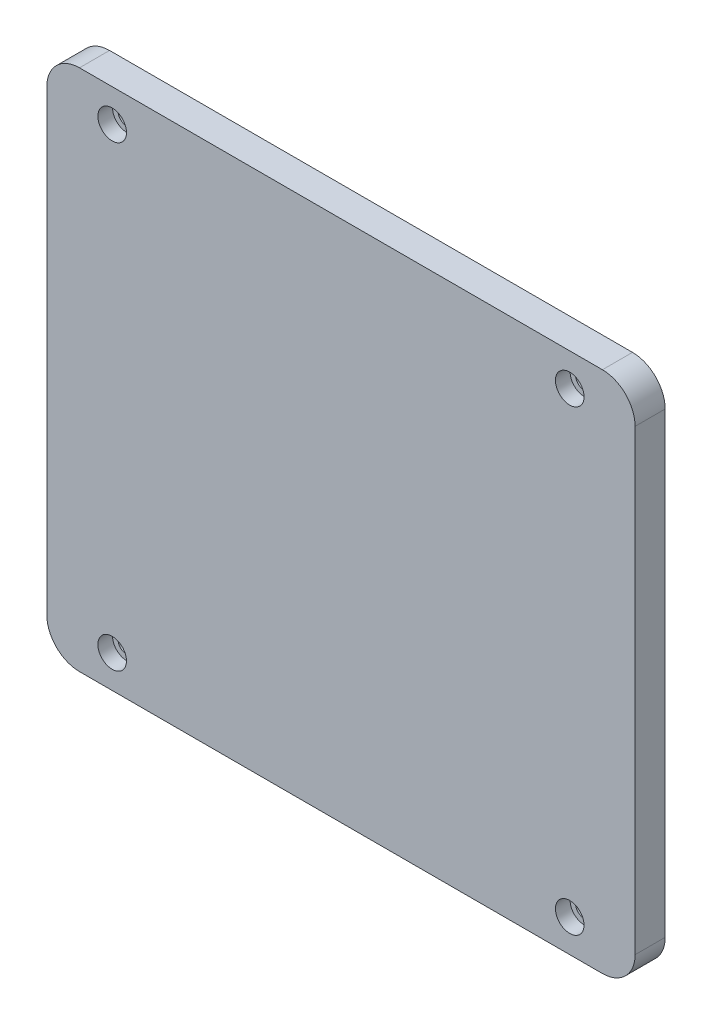
ISO-10303-21;
HEADER;
FILE_DESCRIPTION(('STEP AP214'),'2;1');
FILE_NAME('part.step','',(''),(''),'','','');
FILE_SCHEMA(('AUTOMOTIVE_DESIGN { 1 0 10303 214 1 1 1 1 }'));
ENDSEC;
DATA;
#1=APPLICATION_CONTEXT('core data for automotive mechanical design processes');
#2=APPLICATION_PROTOCOL_DEFINITION('international standard','automotive_design',2000,#1);
#3=PRODUCT_CONTEXT('',#1,'mechanical');
#4=PRODUCT('Part','Part','',(#3));
#5=PRODUCT_RELATED_PRODUCT_CATEGORY('part','',(#4));
#6=PRODUCT_DEFINITION_FORMATION('','',#4);
#7=PRODUCT_DEFINITION_CONTEXT('part definition',#1,'design');
#8=PRODUCT_DEFINITION('design','',#6,#7);
#9=PRODUCT_DEFINITION_SHAPE('','',#8);
#10=(LENGTH_UNIT() NAMED_UNIT(*) SI_UNIT(.MILLI.,.METRE.));
#11=(NAMED_UNIT(*) PLANE_ANGLE_UNIT() SI_UNIT($,.RADIAN.));
#12=(NAMED_UNIT(*) SI_UNIT($,.STERADIAN.) SOLID_ANGLE_UNIT());
#13=UNCERTAINTY_MEASURE_WITH_UNIT(LENGTH_MEASURE(1.E-05),#10,'distance_accuracy_value','');
#14=(GEOMETRIC_REPRESENTATION_CONTEXT(3) GLOBAL_UNCERTAINTY_ASSIGNED_CONTEXT((#13)) GLOBAL_UNIT_ASSIGNED_CONTEXT((#10,
#11,#12)) REPRESENTATION_CONTEXT('',''));
#15=CARTESIAN_POINT('',(0.,0.,0.));
#16=DIRECTION('',(0.,0.,1.));
#17=DIRECTION('',(1.,0.,0.));
#18=AXIS2_PLACEMENT_3D('',#15,#16,#17);
#19=CARTESIAN_POINT('',(57.15,-50.8,5.842));
#20=DIRECTION('',(-1.,0.,0.));
#21=DIRECTION('',(0.,0.,1.));
#22=AXIS2_PLACEMENT_3D('',#19,#20,#21);
#23=PLANE('',#22);
#24=DIRECTION('',(0.,1.,0.));
#25=VECTOR('',#24,1.);
#26=CARTESIAN_POINT('',(57.15,-50.8,0.));
#27=LINE('',#26,#25);
#28=CARTESIAN_POINT('',(57.15,-44.45,0.));
#29=VERTEX_POINT('',#28);
#30=CARTESIAN_POINT('',(57.15,44.45,0.));
#31=VERTEX_POINT('',#30);
#32=EDGE_CURVE('E129',#29,#31,#27,.T.);
#33=ORIENTED_EDGE('',*,*,#32,.T.);
#34=DIRECTION('',(0.,0.,-1.));
#35=VECTOR('',#34,1.);
#36=CARTESIAN_POINT('',(57.15,44.45,5.842));
#37=LINE('',#36,#35);
#38=CARTESIAN_POINT('',(57.15,44.45,5.842));
#39=VERTEX_POINT('',#38);
#40=EDGE_CURVE('E152',#31,#39,#37,.F.);
#41=ORIENTED_EDGE('',*,*,#40,.T.);
#42=DIRECTION('',(0.,1.,0.));
#43=VECTOR('',#42,1.);
#44=CARTESIAN_POINT('',(57.15,-50.8,5.842));
#45=LINE('',#44,#43);
#46=CARTESIAN_POINT('',(57.15,-44.45,5.842));
#47=VERTEX_POINT('',#46);
#48=EDGE_CURVE('E127',#47,#39,#45,.T.);
#49=ORIENTED_EDGE('',*,*,#48,.F.);
#50=DIRECTION('',(0.,0.,-1.));
#51=VECTOR('',#50,1.);
#52=CARTESIAN_POINT('',(57.15,-44.45,5.842));
#53=LINE('',#52,#51);
#54=EDGE_CURVE('E149',#47,#29,#53,.T.);
#55=ORIENTED_EDGE('',*,*,#54,.T.);
#56=EDGE_LOOP('',(#33,#41,#49,#55));
#57=FACE_BOUND('',#56,.T.);
#58=ADVANCED_FACE('F34',(#57),#23,.F.);
#59=CARTESIAN_POINT('',(-57.15,50.8,5.842));
#60=DIRECTION('',(0.,-1.,0.));
#61=DIRECTION('',(0.,0.,-1.));
#62=AXIS2_PLACEMENT_3D('',#59,#60,#61);
#63=PLANE('',#62);
#64=DIRECTION('',(-1.,0.,0.));
#65=VECTOR('',#64,1.);
#66=CARTESIAN_POINT('',(-57.15,50.8,0.));
#67=LINE('',#66,#65);
#68=CARTESIAN_POINT('',(50.8,50.8,0.));
#69=VERTEX_POINT('',#68);
#70=CARTESIAN_POINT('',(-50.8,50.8,0.));
#71=VERTEX_POINT('',#70);
#72=EDGE_CURVE('E125',#69,#71,#67,.T.);
#73=ORIENTED_EDGE('',*,*,#72,.T.);
#74=DIRECTION('',(0.,0.,-1.));
#75=VECTOR('',#74,1.);
#76=CARTESIAN_POINT('',(-50.8,50.8,5.842));
#77=LINE('',#76,#75);
#78=CARTESIAN_POINT('',(-50.8,50.8,5.842));
#79=VERTEX_POINT('',#78);
#80=EDGE_CURVE('E104',#71,#79,#77,.F.);
#81=ORIENTED_EDGE('',*,*,#80,.T.);
#82=DIRECTION('',(-1.,0.,0.));
#83=VECTOR('',#82,1.);
#84=CARTESIAN_POINT('',(-57.15,50.8,5.842));
#85=LINE('',#84,#83);
#86=CARTESIAN_POINT('',(50.8,50.8,5.842));
#87=VERTEX_POINT('',#86);
#88=EDGE_CURVE('E168',#87,#79,#85,.T.);
#89=ORIENTED_EDGE('',*,*,#88,.F.);
#90=DIRECTION('',(0.,0.,-1.));
#91=VECTOR('',#90,1.);
#92=CARTESIAN_POINT('',(50.8,50.8,5.842));
#93=LINE('',#92,#91);
#94=EDGE_CURVE('E109',#87,#69,#93,.T.);
#95=ORIENTED_EDGE('',*,*,#94,.T.);
#96=EDGE_LOOP('',(#73,#81,#89,#95));
#97=FACE_BOUND('',#96,.T.);
#98=ADVANCED_FACE('F242',(#97),#63,.F.);
#99=CARTESIAN_POINT('',(-57.15,-50.8,5.842));
#100=DIRECTION('',(1.,0.,0.));
#101=DIRECTION('',(0.,0.,-1.));
#102=AXIS2_PLACEMENT_3D('',#99,#100,#101);
#103=PLANE('',#102);
#104=DIRECTION('',(0.,-1.,0.));
#105=VECTOR('',#104,1.);
#106=CARTESIAN_POINT('',(-57.15,-50.8,5.842));
#107=LINE('',#106,#105);
#108=CARTESIAN_POINT('',(-57.15,44.45,5.842));
#109=VERTEX_POINT('',#108);
#110=CARTESIAN_POINT('',(-57.15,-44.45,5.842));
#111=VERTEX_POINT('',#110);
#112=EDGE_CURVE('E118',#109,#111,#107,.T.);
#113=ORIENTED_EDGE('',*,*,#112,.F.);
#114=DIRECTION('',(0.,0.,-1.));
#115=VECTOR('',#114,1.);
#116=CARTESIAN_POINT('',(-57.15,44.45,5.842));
#117=LINE('',#116,#115);
#118=CARTESIAN_POINT('',(-57.15,44.45,0.));
#119=VERTEX_POINT('',#118);
#120=EDGE_CURVE('E103',#109,#119,#117,.T.);
#121=ORIENTED_EDGE('',*,*,#120,.T.);
#122=DIRECTION('',(0.,-1.,0.));
#123=VECTOR('',#122,1.);
#124=CARTESIAN_POINT('',(-57.15,-50.8,0.));
#125=LINE('',#124,#123);
#126=CARTESIAN_POINT('',(-57.15,-44.45,0.));
#127=VERTEX_POINT('',#126);
#128=EDGE_CURVE('E116',#119,#127,#125,.T.);
#129=ORIENTED_EDGE('',*,*,#128,.T.);
#130=DIRECTION('',(0.,0.,-1.));
#131=VECTOR('',#130,1.);
#132=CARTESIAN_POINT('',(-57.15,-44.45,5.842));
#133=LINE('',#132,#131);
#134=EDGE_CURVE('E120',#127,#111,#133,.F.);
#135=ORIENTED_EDGE('',*,*,#134,.T.);
#136=EDGE_LOOP('',(#113,#121,#129,#135));
#137=FACE_BOUND('',#136,.T.);
#138=ADVANCED_FACE('F115',(#137),#103,.F.);
#139=CARTESIAN_POINT('',(-57.15,-50.8,5.842));
#140=DIRECTION('',(0.,1.,0.));
#141=DIRECTION('',(0.,0.,1.));
#142=AXIS2_PLACEMENT_3D('',#139,#140,#141);
#143=PLANE('',#142);
#144=DIRECTION('',(1.,0.,0.));
#145=VECTOR('',#144,1.);
#146=CARTESIAN_POINT('',(-57.15,-50.8,0.));
#147=LINE('',#146,#145);
#148=CARTESIAN_POINT('',(-50.8,-50.8,0.));
#149=VERTEX_POINT('',#148);
#150=CARTESIAN_POINT('',(50.8,-50.8,0.));
#151=VERTEX_POINT('',#150);
#152=EDGE_CURVE('E124',#149,#151,#147,.T.);
#153=ORIENTED_EDGE('',*,*,#152,.T.);
#154=DIRECTION('',(0.,0.,-1.));
#155=VECTOR('',#154,1.);
#156=CARTESIAN_POINT('',(50.8,-50.8,5.842));
#157=LINE('',#156,#155);
#158=CARTESIAN_POINT('',(50.8,-50.8,5.842));
#159=VERTEX_POINT('',#158);
#160=EDGE_CURVE('E11',#151,#159,#157,.F.);
#161=ORIENTED_EDGE('',*,*,#160,.T.);
#162=DIRECTION('',(1.,0.,0.));
#163=VECTOR('',#162,1.);
#164=CARTESIAN_POINT('',(-57.15,-50.8,5.842));
#165=LINE('',#164,#163);
#166=CARTESIAN_POINT('',(-50.8,-50.8,5.842));
#167=VERTEX_POINT('',#166);
#168=EDGE_CURVE('E133',#167,#159,#165,.T.);
#169=ORIENTED_EDGE('',*,*,#168,.F.);
#170=DIRECTION('',(0.,0.,-1.));
#171=VECTOR('',#170,1.);
#172=CARTESIAN_POINT('',(-50.8,-50.8,5.842));
#173=LINE('',#172,#171);
#174=EDGE_CURVE('E42',#167,#149,#173,.T.);
#175=ORIENTED_EDGE('',*,*,#174,.T.);
#176=EDGE_LOOP('',(#153,#161,#169,#175));
#177=FACE_BOUND('',#176,.T.);
#178=ADVANCED_FACE('F155',(#177),#143,.F.);
#179=CARTESIAN_POINT('',(0.,0.,5.842));
#180=DIRECTION('',(0.,0.,-1.));
#181=DIRECTION('',(-1.,0.,0.));
#182=AXIS2_PLACEMENT_3D('',#179,#180,#181);
#183=PLANE('',#182);
#184=CARTESIAN_POINT('',(-44.45,44.45,5.842));
#185=DIRECTION('',(0.,0.,1.));
#186=DIRECTION('',(1.,0.,0.));
#187=AXIS2_PLACEMENT_3D('',#184,#185,#186);
#188=CIRCLE('',#187,2.77876);
#189=CARTESIAN_POINT('',(-41.67124,44.45,5.842));
#190=VERTEX_POINT('',#189);
#191=EDGE_CURVE('E224',#190,#190,#188,.T.);
#192=ORIENTED_EDGE('',*,*,#191,.F.);
#193=EDGE_LOOP('',(#192));
#194=FACE_BOUND('',#193,.T.);
#195=CARTESIAN_POINT('',(-44.45,-44.45,5.842));
#196=DIRECTION('',(0.,0.,1.));
#197=DIRECTION('',(1.,0.,0.));
#198=AXIS2_PLACEMENT_3D('',#195,#196,#197);
#199=CIRCLE('',#198,2.77876);
#200=CARTESIAN_POINT('',(-41.67124,-44.45,5.842));
#201=VERTEX_POINT('',#200);
#202=EDGE_CURVE('E212',#201,#201,#199,.T.);
#203=ORIENTED_EDGE('',*,*,#202,.F.);
#204=EDGE_LOOP('',(#203));
#205=FACE_BOUND('',#204,.T.);
#206=CARTESIAN_POINT('',(44.45,-44.45,5.842));
#207=DIRECTION('',(0.,0.,1.));
#208=DIRECTION('',(1.,0.,0.));
#209=AXIS2_PLACEMENT_3D('',#206,#207,#208);
#210=CIRCLE('',#209,2.77876);
#211=CARTESIAN_POINT('',(47.22876,-44.45,5.842));
#212=VERTEX_POINT('',#211);
#213=EDGE_CURVE('E200',#212,#212,#210,.T.);
#214=ORIENTED_EDGE('',*,*,#213,.F.);
#215=EDGE_LOOP('',(#214));
#216=FACE_BOUND('',#215,.T.);
#217=CARTESIAN_POINT('',(44.45,44.45,5.842));
#218=DIRECTION('',(0.,0.,1.));
#219=DIRECTION('',(1.,0.,0.));
#220=AXIS2_PLACEMENT_3D('',#217,#218,#219);
#221=CIRCLE('',#220,2.77876);
#222=CARTESIAN_POINT('',(47.22876,44.45,5.842));
#223=VERTEX_POINT('',#222);
#224=EDGE_CURVE('E186',#223,#223,#221,.T.);
#225=ORIENTED_EDGE('',*,*,#224,.F.);
#226=EDGE_LOOP('',(#225));
#227=FACE_BOUND('',#226,.T.);
#228=ORIENTED_EDGE('',*,*,#88,.T.);
#229=CARTESIAN_POINT('',(-50.8,44.45,5.842));
#230=DIRECTION('',(0.,0.,-1.));
#231=DIRECTION('',(-1.,0.,0.));
#232=AXIS2_PLACEMENT_3D('',#229,#230,#231);
#233=CIRCLE('',#232,6.35);
#234=EDGE_CURVE('E147',#79,#109,#233,.F.);
#235=ORIENTED_EDGE('',*,*,#234,.T.);
#236=ORIENTED_EDGE('',*,*,#112,.T.);
#237=CARTESIAN_POINT('',(-50.8,-44.45,5.842));
#238=DIRECTION('',(0.,0.,-1.));
#239=DIRECTION('',(-1.,0.,0.));
#240=AXIS2_PLACEMENT_3D('',#237,#238,#239);
#241=CIRCLE('',#240,6.35);
#242=EDGE_CURVE('E54',#111,#167,#241,.F.);
#243=ORIENTED_EDGE('',*,*,#242,.T.);
#244=ORIENTED_EDGE('',*,*,#168,.T.);
#245=CARTESIAN_POINT('',(50.8,-44.45,5.842));
#246=DIRECTION('',(0.,0.,-1.));
#247=DIRECTION('',(-1.,0.,0.));
#248=AXIS2_PLACEMENT_3D('',#245,#246,#247);
#249=CIRCLE('',#248,6.35);
#250=EDGE_CURVE('E143',#159,#47,#249,.F.);
#251=ORIENTED_EDGE('',*,*,#250,.T.);
#252=ORIENTED_EDGE('',*,*,#48,.T.);
#253=CARTESIAN_POINT('',(50.8,44.45,5.842));
#254=DIRECTION('',(0.,0.,-1.));
#255=DIRECTION('',(-1.,0.,0.));
#256=AXIS2_PLACEMENT_3D('',#253,#254,#255);
#257=CIRCLE('',#256,6.35);
#258=EDGE_CURVE('E145',#39,#87,#257,.F.);
#259=ORIENTED_EDGE('',*,*,#258,.T.);
#260=EDGE_LOOP('',(#228,#235,#236,#243,#244,#251,#252,#259));
#261=FACE_BOUND('',#260,.T.);
#262=ADVANCED_FACE('F230',(#194,#205,#216,#227,#261),#183,.F.);
#263=CARTESIAN_POINT('',(0.,0.,0.));
#264=DIRECTION('',(0.,0.,-1.));
#265=DIRECTION('',(-1.,0.,0.));
#266=AXIS2_PLACEMENT_3D('',#263,#264,#265);
#267=PLANE('',#266);
#268=CARTESIAN_POINT('',(-44.45,44.45,0.));
#269=DIRECTION('',(0.,0.,1.));
#270=DIRECTION('',(1.,0.,0.));
#271=AXIS2_PLACEMENT_3D('',#268,#269,#270);
#272=CIRCLE('',#271,1.7272);
#273=CARTESIAN_POINT('',(-42.7228,44.45,0.));
#274=VERTEX_POINT('',#273);
#275=EDGE_CURVE('E215',#274,#274,#272,.T.);
#276=ORIENTED_EDGE('',*,*,#275,.T.);
#277=EDGE_LOOP('',(#276));
#278=FACE_BOUND('',#277,.T.);
#279=CARTESIAN_POINT('',(-44.45,-44.45,0.));
#280=DIRECTION('',(0.,0.,1.));
#281=DIRECTION('',(1.,0.,0.));
#282=AXIS2_PLACEMENT_3D('',#279,#280,#281);
#283=CIRCLE('',#282,1.7272);
#284=CARTESIAN_POINT('',(-42.7228,-44.45,0.));
#285=VERTEX_POINT('',#284);
#286=EDGE_CURVE('E203',#285,#285,#283,.T.);
#287=ORIENTED_EDGE('',*,*,#286,.T.);
#288=EDGE_LOOP('',(#287));
#289=FACE_BOUND('',#288,.T.);
#290=CARTESIAN_POINT('',(44.45,-44.45,0.));
#291=DIRECTION('',(0.,0.,1.));
#292=DIRECTION('',(1.,0.,0.));
#293=AXIS2_PLACEMENT_3D('',#290,#291,#292);
#294=CIRCLE('',#293,1.7272);
#295=CARTESIAN_POINT('',(46.1772,-44.45,0.));
#296=VERTEX_POINT('',#295);
#297=EDGE_CURVE('E191',#296,#296,#294,.T.);
#298=ORIENTED_EDGE('',*,*,#297,.T.);
#299=EDGE_LOOP('',(#298));
#300=FACE_BOUND('',#299,.T.);
#301=CARTESIAN_POINT('',(44.45,44.45,0.));
#302=DIRECTION('',(0.,0.,1.));
#303=DIRECTION('',(1.,0.,0.));
#304=AXIS2_PLACEMENT_3D('',#301,#302,#303);
#305=CIRCLE('',#304,1.7272);
#306=CARTESIAN_POINT('',(46.1772,44.45,0.));
#307=VERTEX_POINT('',#306);
#308=EDGE_CURVE('E173',#307,#307,#305,.T.);
#309=ORIENTED_EDGE('',*,*,#308,.T.);
#310=EDGE_LOOP('',(#309));
#311=FACE_BOUND('',#310,.T.);
#312=ORIENTED_EDGE('',*,*,#128,.F.);
#313=CARTESIAN_POINT('',(-50.8,44.45,0.));
#314=DIRECTION('',(0.,0.,-1.));
#315=DIRECTION('',(-1.,0.,0.));
#316=AXIS2_PLACEMENT_3D('',#313,#314,#315);
#317=CIRCLE('',#316,6.35);
#318=EDGE_CURVE('E99',#119,#71,#317,.T.);
#319=ORIENTED_EDGE('',*,*,#318,.T.);
#320=ORIENTED_EDGE('',*,*,#72,.F.);
#321=CARTESIAN_POINT('',(50.8,44.45,0.));
#322=DIRECTION('',(0.,0.,-1.));
#323=DIRECTION('',(-1.,0.,0.));
#324=AXIS2_PLACEMENT_3D('',#321,#322,#323);
#325=CIRCLE('',#324,6.35);
#326=EDGE_CURVE('E110',#69,#31,#325,.T.);
#327=ORIENTED_EDGE('',*,*,#326,.T.);
#328=ORIENTED_EDGE('',*,*,#32,.F.);
#329=CARTESIAN_POINT('',(50.8,-44.45,0.));
#330=DIRECTION('',(0.,0.,-1.));
#331=DIRECTION('',(-1.,0.,0.));
#332=AXIS2_PLACEMENT_3D('',#329,#330,#331);
#333=CIRCLE('',#332,6.35);
#334=EDGE_CURVE('E136',#29,#151,#333,.T.);
#335=ORIENTED_EDGE('',*,*,#334,.T.);
#336=ORIENTED_EDGE('',*,*,#152,.F.);
#337=CARTESIAN_POINT('',(-50.8,-44.45,0.));
#338=DIRECTION('',(0.,0.,-1.));
#339=DIRECTION('',(-1.,0.,0.));
#340=AXIS2_PLACEMENT_3D('',#337,#338,#339);
#341=CIRCLE('',#340,6.35);
#342=EDGE_CURVE('E119',#149,#127,#341,.T.);
#343=ORIENTED_EDGE('',*,*,#342,.T.);
#344=EDGE_LOOP('',(#312,#319,#320,#327,#328,#335,#336,#343));
#345=FACE_BOUND('',#344,.T.);
#346=ADVANCED_FACE('F122',(#278,#289,#300,#311,#345),#267,.T.);
#347=CARTESIAN_POINT('',(44.45,44.45,5.842));
#348=DIRECTION('',(0.,0.,1.));
#349=DIRECTION('',(1.,0.,0.));
#350=AXIS2_PLACEMENT_3D('',#347,#348,#349);
#351=CYLINDRICAL_SURFACE('',#350,1.7272);
#352=ORIENTED_EDGE('',*,*,#308,.F.);
#353=EDGE_LOOP('',(#352));
#354=FACE_BOUND('',#353,.T.);
#355=CARTESIAN_POINT('',(44.45,44.45,2.9972));
#356=DIRECTION('',(0.,0.,1.));
#357=DIRECTION('',(1.,0.,0.));
#358=AXIS2_PLACEMENT_3D('',#355,#356,#357);
#359=CIRCLE('',#358,1.7272);
#360=CARTESIAN_POINT('',(46.1772,44.45,2.9972));
#361=VERTEX_POINT('',#360);
#362=EDGE_CURVE('E178',#361,#361,#359,.T.);
#363=ORIENTED_EDGE('',*,*,#362,.T.);
#364=EDGE_LOOP('',(#363));
#365=FACE_BOUND('',#364,.T.);
#366=ADVANCED_FACE('F264',(#354,#365),#351,.F.);
#367=CARTESIAN_POINT('',(46.1772,44.45,2.9972));
#368=DIRECTION('',(0.,0.,-1.));
#369=DIRECTION('',(-1.,0.,0.));
#370=AXIS2_PLACEMENT_3D('',#367,#368,#369);
#371=PLANE('',#370);
#372=ORIENTED_EDGE('',*,*,#362,.F.);
#373=EDGE_LOOP('',(#372));
#374=FACE_BOUND('',#373,.T.);
#375=CARTESIAN_POINT('',(44.45,44.45,2.9972));
#376=DIRECTION('',(0.,0.,1.));
#377=DIRECTION('',(1.,0.,0.));
#378=AXIS2_PLACEMENT_3D('',#375,#376,#377);
#379=CIRCLE('',#378,2.77876);
#380=CARTESIAN_POINT('',(47.22876,44.45,2.9972));
#381=VERTEX_POINT('',#380);
#382=EDGE_CURVE('E182',#381,#381,#379,.T.);
#383=ORIENTED_EDGE('',*,*,#382,.T.);
#384=EDGE_LOOP('',(#383));
#385=FACE_BOUND('',#384,.T.);
#386=ADVANCED_FACE('F269',(#374,#385),#371,.F.);
#387=CARTESIAN_POINT('',(44.45,44.45,5.842));
#388=DIRECTION('',(0.,0.,1.));
#389=DIRECTION('',(1.,0.,0.));
#390=AXIS2_PLACEMENT_3D('',#387,#388,#389);
#391=CYLINDRICAL_SURFACE('',#390,2.77876);
#392=ORIENTED_EDGE('',*,*,#382,.F.);
#393=EDGE_LOOP('',(#392));
#394=FACE_BOUND('',#393,.T.);
#395=ORIENTED_EDGE('',*,*,#224,.T.);
#396=EDGE_LOOP('',(#395));
#397=FACE_BOUND('',#396,.T.);
#398=ADVANCED_FACE('F273',(#394,#397),#391,.F.);
#399=CARTESIAN_POINT('',(44.45,-44.45,5.842));
#400=DIRECTION('',(0.,0.,1.));
#401=DIRECTION('',(1.,0.,0.));
#402=AXIS2_PLACEMENT_3D('',#399,#400,#401);
#403=CYLINDRICAL_SURFACE('',#402,1.7272);
#404=ORIENTED_EDGE('',*,*,#297,.F.);
#405=EDGE_LOOP('',(#404));
#406=FACE_BOUND('',#405,.T.);
#407=CARTESIAN_POINT('',(44.45,-44.45,2.9972));
#408=DIRECTION('',(0.,0.,1.));
#409=DIRECTION('',(1.,0.,0.));
#410=AXIS2_PLACEMENT_3D('',#407,#408,#409);
#411=CIRCLE('',#410,1.7272);
#412=CARTESIAN_POINT('',(46.1772,-44.45,2.9972));
#413=VERTEX_POINT('',#412);
#414=EDGE_CURVE('E194',#413,#413,#411,.T.);
#415=ORIENTED_EDGE('',*,*,#414,.T.);
#416=EDGE_LOOP('',(#415));
#417=FACE_BOUND('',#416,.T.);
#418=ADVANCED_FACE('F277',(#406,#417),#403,.F.);
#419=CARTESIAN_POINT('',(46.1772,-44.45,2.9972));
#420=DIRECTION('',(0.,0.,-1.));
#421=DIRECTION('',(-1.,0.,0.));
#422=AXIS2_PLACEMENT_3D('',#419,#420,#421);
#423=PLANE('',#422);
#424=ORIENTED_EDGE('',*,*,#414,.F.);
#425=EDGE_LOOP('',(#424));
#426=FACE_BOUND('',#425,.T.);
#427=CARTESIAN_POINT('',(44.45,-44.45,2.9972));
#428=DIRECTION('',(0.,0.,1.));
#429=DIRECTION('',(1.,0.,0.));
#430=AXIS2_PLACEMENT_3D('',#427,#428,#429);
#431=CIRCLE('',#430,2.77876);
#432=CARTESIAN_POINT('',(47.22876,-44.45,2.9972));
#433=VERTEX_POINT('',#432);
#434=EDGE_CURVE('E197',#433,#433,#431,.T.);
#435=ORIENTED_EDGE('',*,*,#434,.T.);
#436=EDGE_LOOP('',(#435));
#437=FACE_BOUND('',#436,.T.);
#438=ADVANCED_FACE('F281',(#426,#437),#423,.F.);
#439=CARTESIAN_POINT('',(44.45,-44.45,5.842));
#440=DIRECTION('',(0.,0.,1.));
#441=DIRECTION('',(1.,0.,0.));
#442=AXIS2_PLACEMENT_3D('',#439,#440,#441);
#443=CYLINDRICAL_SURFACE('',#442,2.77876);
#444=ORIENTED_EDGE('',*,*,#434,.F.);
#445=EDGE_LOOP('',(#444));
#446=FACE_BOUND('',#445,.T.);
#447=ORIENTED_EDGE('',*,*,#213,.T.);
#448=EDGE_LOOP('',(#447));
#449=FACE_BOUND('',#448,.T.);
#450=ADVANCED_FACE('F285',(#446,#449),#443,.F.);
#451=CARTESIAN_POINT('',(-44.45,-44.45,5.842));
#452=DIRECTION('',(0.,0.,1.));
#453=DIRECTION('',(1.,0.,0.));
#454=AXIS2_PLACEMENT_3D('',#451,#452,#453);
#455=CYLINDRICAL_SURFACE('',#454,1.7272);
#456=ORIENTED_EDGE('',*,*,#286,.F.);
#457=EDGE_LOOP('',(#456));
#458=FACE_BOUND('',#457,.T.);
#459=CARTESIAN_POINT('',(-44.45,-44.45,2.9972));
#460=DIRECTION('',(0.,0.,1.));
#461=DIRECTION('',(1.,0.,0.));
#462=AXIS2_PLACEMENT_3D('',#459,#460,#461);
#463=CIRCLE('',#462,1.7272);
#464=CARTESIAN_POINT('',(-42.7228,-44.45,2.9972));
#465=VERTEX_POINT('',#464);
#466=EDGE_CURVE('E206',#465,#465,#463,.T.);
#467=ORIENTED_EDGE('',*,*,#466,.T.);
#468=EDGE_LOOP('',(#467));
#469=FACE_BOUND('',#468,.T.);
#470=ADVANCED_FACE('F289',(#458,#469),#455,.F.);
#471=CARTESIAN_POINT('',(-42.7228,-44.45,2.9972));
#472=DIRECTION('',(0.,0.,-1.));
#473=DIRECTION('',(-1.,0.,0.));
#474=AXIS2_PLACEMENT_3D('',#471,#472,#473);
#475=PLANE('',#474);
#476=ORIENTED_EDGE('',*,*,#466,.F.);
#477=EDGE_LOOP('',(#476));
#478=FACE_BOUND('',#477,.T.);
#479=CARTESIAN_POINT('',(-44.45,-44.45,2.9972));
#480=DIRECTION('',(0.,0.,1.));
#481=DIRECTION('',(1.,0.,0.));
#482=AXIS2_PLACEMENT_3D('',#479,#480,#481);
#483=CIRCLE('',#482,2.77876);
#484=CARTESIAN_POINT('',(-41.67124,-44.45,2.9972));
#485=VERTEX_POINT('',#484);
#486=EDGE_CURVE('E209',#485,#485,#483,.T.);
#487=ORIENTED_EDGE('',*,*,#486,.T.);
#488=EDGE_LOOP('',(#487));
#489=FACE_BOUND('',#488,.T.);
#490=ADVANCED_FACE('F293',(#478,#489),#475,.F.);
#491=CARTESIAN_POINT('',(-44.45,-44.45,5.842));
#492=DIRECTION('',(0.,0.,1.));
#493=DIRECTION('',(1.,0.,0.));
#494=AXIS2_PLACEMENT_3D('',#491,#492,#493);
#495=CYLINDRICAL_SURFACE('',#494,2.77876);
#496=ORIENTED_EDGE('',*,*,#486,.F.);
#497=EDGE_LOOP('',(#496));
#498=FACE_BOUND('',#497,.T.);
#499=ORIENTED_EDGE('',*,*,#202,.T.);
#500=EDGE_LOOP('',(#499));
#501=FACE_BOUND('',#500,.T.);
#502=ADVANCED_FACE('F297',(#498,#501),#495,.F.);
#503=CARTESIAN_POINT('',(-44.45,44.45,5.842));
#504=DIRECTION('',(0.,0.,1.));
#505=DIRECTION('',(1.,0.,0.));
#506=AXIS2_PLACEMENT_3D('',#503,#504,#505);
#507=CYLINDRICAL_SURFACE('',#506,1.7272);
#508=ORIENTED_EDGE('',*,*,#275,.F.);
#509=EDGE_LOOP('',(#508));
#510=FACE_BOUND('',#509,.T.);
#511=CARTESIAN_POINT('',(-44.45,44.45,2.9972));
#512=DIRECTION('',(0.,0.,1.));
#513=DIRECTION('',(1.,0.,0.));
#514=AXIS2_PLACEMENT_3D('',#511,#512,#513);
#515=CIRCLE('',#514,1.7272);
#516=CARTESIAN_POINT('',(-42.7228,44.45,2.9972));
#517=VERTEX_POINT('',#516);
#518=EDGE_CURVE('E218',#517,#517,#515,.T.);
#519=ORIENTED_EDGE('',*,*,#518,.T.);
#520=EDGE_LOOP('',(#519));
#521=FACE_BOUND('',#520,.T.);
#522=ADVANCED_FACE('F301',(#510,#521),#507,.F.);
#523=CARTESIAN_POINT('',(-42.7228,44.45,2.9972));
#524=DIRECTION('',(0.,0.,-1.));
#525=DIRECTION('',(-1.,0.,0.));
#526=AXIS2_PLACEMENT_3D('',#523,#524,#525);
#527=PLANE('',#526);
#528=ORIENTED_EDGE('',*,*,#518,.F.);
#529=EDGE_LOOP('',(#528));
#530=FACE_BOUND('',#529,.T.);
#531=CARTESIAN_POINT('',(-44.45,44.45,2.9972));
#532=DIRECTION('',(0.,0.,1.));
#533=DIRECTION('',(1.,0.,0.));
#534=AXIS2_PLACEMENT_3D('',#531,#532,#533);
#535=CIRCLE('',#534,2.77876);
#536=CARTESIAN_POINT('',(-41.67124,44.45,2.9972));
#537=VERTEX_POINT('',#536);
#538=EDGE_CURVE('E221',#537,#537,#535,.T.);
#539=ORIENTED_EDGE('',*,*,#538,.T.);
#540=EDGE_LOOP('',(#539));
#541=FACE_BOUND('',#540,.T.);
#542=ADVANCED_FACE('F305',(#530,#541),#527,.F.);
#543=CARTESIAN_POINT('',(-44.45,44.45,5.842));
#544=DIRECTION('',(0.,0.,1.));
#545=DIRECTION('',(1.,0.,0.));
#546=AXIS2_PLACEMENT_3D('',#543,#544,#545);
#547=CYLINDRICAL_SURFACE('',#546,2.77876);
#548=ORIENTED_EDGE('',*,*,#538,.F.);
#549=EDGE_LOOP('',(#548));
#550=FACE_BOUND('',#549,.T.);
#551=ORIENTED_EDGE('',*,*,#191,.T.);
#552=EDGE_LOOP('',(#551));
#553=FACE_BOUND('',#552,.T.);
#554=ADVANCED_FACE('F228',(#550,#553),#547,.F.);
#555=CARTESIAN_POINT('',(-50.8,44.45,5.842));
#556=DIRECTION('',(0.,0.,-1.));
#557=DIRECTION('',(-1.,0.,0.));
#558=AXIS2_PLACEMENT_3D('',#555,#556,#557);
#559=CYLINDRICAL_SURFACE('',#558,6.35);
#560=ORIENTED_EDGE('',*,*,#234,.F.);
#561=ORIENTED_EDGE('',*,*,#80,.F.);
#562=ORIENTED_EDGE('',*,*,#318,.F.);
#563=ORIENTED_EDGE('',*,*,#120,.F.);
#564=EDGE_LOOP('',(#560,#561,#562,#563));
#565=FACE_BOUND('',#564,.T.);
#566=ADVANCED_FACE('F102',(#565),#559,.T.);
#567=CARTESIAN_POINT('',(50.8,44.45,5.842));
#568=DIRECTION('',(0.,0.,-1.));
#569=DIRECTION('',(-1.,0.,0.));
#570=AXIS2_PLACEMENT_3D('',#567,#568,#569);
#571=CYLINDRICAL_SURFACE('',#570,6.35);
#572=ORIENTED_EDGE('',*,*,#258,.F.);
#573=ORIENTED_EDGE('',*,*,#40,.F.);
#574=ORIENTED_EDGE('',*,*,#326,.F.);
#575=ORIENTED_EDGE('',*,*,#94,.F.);
#576=EDGE_LOOP('',(#572,#573,#574,#575));
#577=FACE_BOUND('',#576,.T.);
#578=ADVANCED_FACE('F244',(#577),#571,.T.);
#579=CARTESIAN_POINT('',(50.8,-44.45,5.842));
#580=DIRECTION('',(0.,0.,-1.));
#581=DIRECTION('',(-1.,0.,0.));
#582=AXIS2_PLACEMENT_3D('',#579,#580,#581);
#583=CYLINDRICAL_SURFACE('',#582,6.35);
#584=ORIENTED_EDGE('',*,*,#250,.F.);
#585=ORIENTED_EDGE('',*,*,#160,.F.);
#586=ORIENTED_EDGE('',*,*,#334,.F.);
#587=ORIENTED_EDGE('',*,*,#54,.F.);
#588=EDGE_LOOP('',(#584,#585,#586,#587));
#589=FACE_BOUND('',#588,.T.);
#590=ADVANCED_FACE('F162',(#589),#583,.T.);
#591=CARTESIAN_POINT('',(-50.8,-44.45,5.842));
#592=DIRECTION('',(0.,0.,-1.));
#593=DIRECTION('',(-1.,0.,0.));
#594=AXIS2_PLACEMENT_3D('',#591,#592,#593);
#595=CYLINDRICAL_SURFACE('',#594,6.35);
#596=ORIENTED_EDGE('',*,*,#242,.F.);
#597=ORIENTED_EDGE('',*,*,#134,.F.);
#598=ORIENTED_EDGE('',*,*,#342,.F.);
#599=ORIENTED_EDGE('',*,*,#174,.F.);
#600=EDGE_LOOP('',(#596,#597,#598,#599));
#601=FACE_BOUND('',#600,.T.);
#602=ADVANCED_FACE('F36',(#601),#595,.T.);
#603=CLOSED_SHELL('',(#58,#98,#138,#178,#262,#346,#366,#386,#398,#418,#438,#450,#470,#490,#502,
#522,#542,#554,#566,#578,#590,#602));
#604=MANIFOLD_SOLID_BREP('B2',#603);
#605=ADVANCED_BREP_SHAPE_REPRESENTATION('',(#18,#604),#14);
#606=SHAPE_DEFINITION_REPRESENTATION(#9,#605);
ENDSEC;
END-ISO-10303-21;
